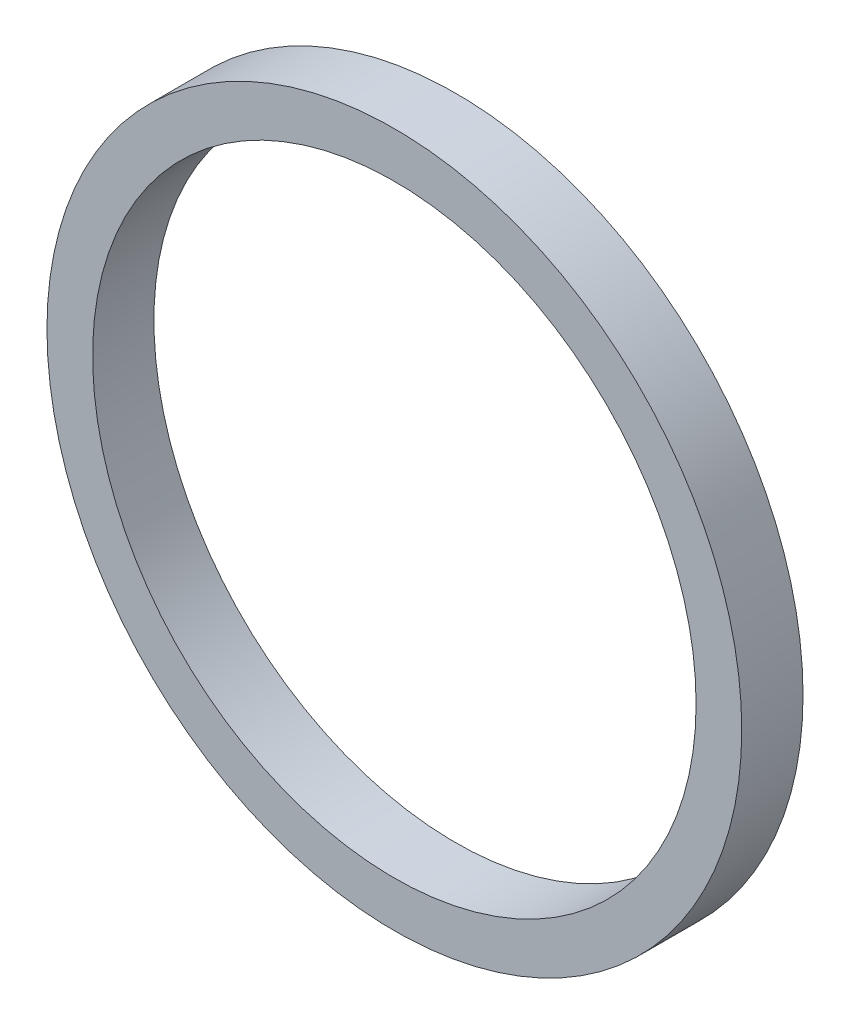
ISO-10303-21;
HEADER;
FILE_DESCRIPTION(('STEP AP214'),'2;1');
FILE_NAME('part.step','',(''),(''),'','','');
FILE_SCHEMA(('AUTOMOTIVE_DESIGN { 1 0 10303 214 1 1 1 1 }'));
ENDSEC;
DATA;
#1=APPLICATION_CONTEXT('core data for automotive mechanical design processes');
#2=APPLICATION_PROTOCOL_DEFINITION('international standard','automotive_design',2000,#1);
#3=PRODUCT_CONTEXT('',#1,'mechanical');
#4=PRODUCT('Part','Part','',(#3));
#5=PRODUCT_RELATED_PRODUCT_CATEGORY('part','',(#4));
#6=PRODUCT_DEFINITION_FORMATION('','',#4);
#7=PRODUCT_DEFINITION_CONTEXT('part definition',#1,'design');
#8=PRODUCT_DEFINITION('design','',#6,#7);
#9=PRODUCT_DEFINITION_SHAPE('','',#8);
#10=(LENGTH_UNIT() NAMED_UNIT(*) SI_UNIT(.MILLI.,.METRE.));
#11=(NAMED_UNIT(*) PLANE_ANGLE_UNIT() SI_UNIT($,.RADIAN.));
#12=(NAMED_UNIT(*) SI_UNIT($,.STERADIAN.) SOLID_ANGLE_UNIT());
#13=UNCERTAINTY_MEASURE_WITH_UNIT(LENGTH_MEASURE(1.E-05),#10,'distance_accuracy_value','');
#14=(GEOMETRIC_REPRESENTATION_CONTEXT(3) GLOBAL_UNCERTAINTY_ASSIGNED_CONTEXT((#13)) GLOBAL_UNIT_ASSIGNED_CONTEXT((#10,
#11,#12)) REPRESENTATION_CONTEXT('',''));
#15=CARTESIAN_POINT('',(0.,0.,0.));
#16=DIRECTION('',(0.,0.,1.));
#17=DIRECTION('',(1.,0.,0.));
#18=AXIS2_PLACEMENT_3D('',#15,#16,#17);
#19=CARTESIAN_POINT('',(3.68962912087912,0.,-0.758760243513404));
#20=DIRECTION('',(0.,0.,1.));
#21=DIRECTION('',(1.,0.,0.));
#22=AXIS2_PLACEMENT_3D('',#19,#20,#21);
#23=PLANE('',#22);
#24=CARTESIAN_POINT('',(0.,0.,-0.758760243513404));
#25=DIRECTION('',(0.,0.,1.));
#26=DIRECTION('',(1.,0.,0.));
#27=AXIS2_PLACEMENT_3D('',#24,#25,#26);
#28=CIRCLE('',#27,4.24787087912088);
#29=CARTESIAN_POINT('',(4.24787087912088,0.,-0.758760243513404));
#30=VERTEX_POINT('',#29);
#31=EDGE_CURVE('E10',#30,#30,#28,.T.);
#32=ORIENTED_EDGE('',*,*,#31,.T.);
#33=EDGE_LOOP('',(#32));
#34=FACE_BOUND('',#33,.T.);
#35=CARTESIAN_POINT('',(0.,0.,-0.758760243513405));
#36=DIRECTION('',(0.,0.,1.));
#37=DIRECTION('',(1.,0.,0.));
#38=AXIS2_PLACEMENT_3D('',#35,#36,#37);
#39=CIRCLE('',#38,3.68962912087912);
#40=CARTESIAN_POINT('',(3.68962912087912,0.,-0.758760243513405));
#41=VERTEX_POINT('',#40);
#42=EDGE_CURVE('E50',#41,#41,#39,.T.);
#43=ORIENTED_EDGE('',*,*,#42,.F.);
#44=EDGE_LOOP('',(#43));
#45=FACE_BOUND('',#44,.T.);
#46=ADVANCED_FACE('F36',(#34,#45),#23,.T.);
#47=CARTESIAN_POINT('',(0.,0.,-1.508125));
#48=DIRECTION('',(0.,0.,1.));
#49=DIRECTION('',(1.,0.,0.));
#50=AXIS2_PLACEMENT_3D('',#47,#48,#49);
#51=CYLINDRICAL_SURFACE('',#50,4.24787087912088);
#52=CARTESIAN_POINT('',(0.,0.,-1.508125));
#53=DIRECTION('',(0.,0.,1.));
#54=DIRECTION('',(1.,0.,0.));
#55=AXIS2_PLACEMENT_3D('',#52,#53,#54);
#56=CIRCLE('',#55,4.24787087912088);
#57=CARTESIAN_POINT('',(4.24787087912088,0.,-1.508125));
#58=VERTEX_POINT('',#57);
#59=EDGE_CURVE('E42',#58,#58,#56,.T.);
#60=ORIENTED_EDGE('',*,*,#59,.T.);
#61=EDGE_LOOP('',(#60));
#62=FACE_BOUND('',#61,.T.);
#63=ORIENTED_EDGE('',*,*,#31,.F.);
#64=EDGE_LOOP('',(#63));
#65=FACE_BOUND('',#64,.T.);
#66=ADVANCED_FACE('F60',(#62,#65),#51,.T.);
#67=CARTESIAN_POINT('',(4.24787087912088,0.,-1.508125));
#68=DIRECTION('',(0.,0.,-1.));
#69=DIRECTION('',(-1.,0.,0.));
#70=AXIS2_PLACEMENT_3D('',#67,#68,#69);
#71=PLANE('',#70);
#72=CARTESIAN_POINT('',(0.,0.,-1.508125));
#73=DIRECTION('',(0.,0.,1.));
#74=DIRECTION('',(1.,0.,0.));
#75=AXIS2_PLACEMENT_3D('',#72,#73,#74);
#76=CIRCLE('',#75,3.68962912087912);
#77=CARTESIAN_POINT('',(3.68962912087912,0.,-1.508125));
#78=VERTEX_POINT('',#77);
#79=EDGE_CURVE('E46',#78,#78,#76,.T.);
#80=ORIENTED_EDGE('',*,*,#79,.T.);
#81=EDGE_LOOP('',(#80));
#82=FACE_BOUND('',#81,.T.);
#83=ORIENTED_EDGE('',*,*,#59,.F.);
#84=EDGE_LOOP('',(#83));
#85=FACE_BOUND('',#84,.T.);
#86=ADVANCED_FACE('F64',(#82,#85),#71,.T.);
#87=CARTESIAN_POINT('',(0.,0.,-1.508125));
#88=DIRECTION('',(0.,0.,1.));
#89=DIRECTION('',(1.,0.,0.));
#90=AXIS2_PLACEMENT_3D('',#87,#88,#89);
#91=CYLINDRICAL_SURFACE('',#90,3.68962912087912);
#92=ORIENTED_EDGE('',*,*,#42,.T.);
#93=EDGE_LOOP('',(#92));
#94=FACE_BOUND('',#93,.T.);
#95=ORIENTED_EDGE('',*,*,#79,.F.);
#96=EDGE_LOOP('',(#95));
#97=FACE_BOUND('',#96,.T.);
#98=ADVANCED_FACE('F56',(#94,#97),#91,.F.);
#99=CLOSED_SHELL('',(#46,#66,#86,#98));
#100=MANIFOLD_SOLID_BREP('B2',#99);
#101=ADVANCED_BREP_SHAPE_REPRESENTATION('',(#18,#100),#14);
#102=SHAPE_DEFINITION_REPRESENTATION(#9,#101);
ENDSEC;
END-ISO-10303-21;
